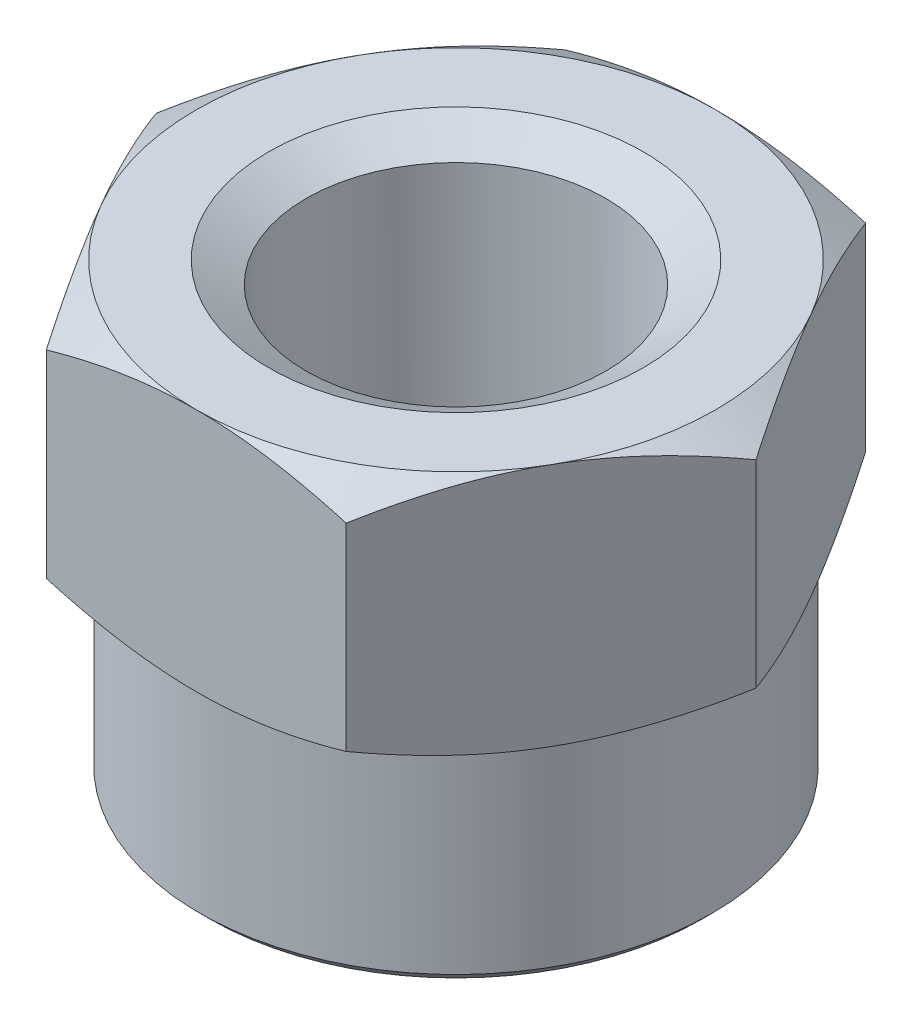
ISO-10303-21;
HEADER;
FILE_DESCRIPTION(('STEP AP214'),'2;1');
FILE_NAME('part.step','',(''),(''),'','','');
FILE_SCHEMA(('AUTOMOTIVE_DESIGN { 1 0 10303 214 1 1 1 1 }'));
ENDSEC;
DATA;
#1=APPLICATION_CONTEXT('core data for automotive mechanical design processes');
#2=APPLICATION_PROTOCOL_DEFINITION('international standard','automotive_design',2000,#1);
#3=PRODUCT_CONTEXT('',#1,'mechanical');
#4=PRODUCT('Part','Part','',(#3));
#5=PRODUCT_RELATED_PRODUCT_CATEGORY('part','',(#4));
#6=PRODUCT_DEFINITION_FORMATION('','',#4);
#7=PRODUCT_DEFINITION_CONTEXT('part definition',#1,'design');
#8=PRODUCT_DEFINITION('design','',#6,#7);
#9=PRODUCT_DEFINITION_SHAPE('','',#8);
#10=(LENGTH_UNIT() NAMED_UNIT(*) SI_UNIT(.MILLI.,.METRE.));
#11=(NAMED_UNIT(*) PLANE_ANGLE_UNIT() SI_UNIT($,.RADIAN.));
#12=(NAMED_UNIT(*) SI_UNIT($,.STERADIAN.) SOLID_ANGLE_UNIT());
#13=UNCERTAINTY_MEASURE_WITH_UNIT(LENGTH_MEASURE(1.E-05),#10,'distance_accuracy_value','');
#14=(GEOMETRIC_REPRESENTATION_CONTEXT(3) GLOBAL_UNCERTAINTY_ASSIGNED_CONTEXT((#13)) GLOBAL_UNIT_ASSIGNED_CONTEXT((#10,
#11,#12)) REPRESENTATION_CONTEXT('',''));
#15=CARTESIAN_POINT('',(0.,0.,0.));
#16=DIRECTION('',(0.,0.,1.));
#17=DIRECTION('',(1.,0.,0.));
#18=AXIS2_PLACEMENT_3D('',#15,#16,#17);
#19=CARTESIAN_POINT('',(-127.492839525484,85.4251261180788,144.216684572446));
#20=DIRECTION('',(0.,-1.,0.));
#21=DIRECTION('',(1.,0.,0.));
#22=AXIS2_PLACEMENT_3D('',#19,#20,#21);
#23=PLANE('',#22);
#24=CARTESIAN_POINT('',(-134.421042755759,85.4251261180788,156.216684572446));
#25=DIRECTION('',(0.,-1.,0.));
#26=DIRECTION('',(1.,0.,0.));
#27=AXIS2_PLACEMENT_3D('',#24,#25,#26);
#28=CIRCLE('',#27,6.9175);
#29=CARTESIAN_POINT('',(-127.503542755759,85.4251261180788,156.216684572446));
#30=VERTEX_POINT('',#29);
#31=EDGE_CURVE('E186',#30,#30,#28,.T.);
#32=ORIENTED_EDGE('',*,*,#31,.F.);
#33=EDGE_LOOP('',(#32));
#34=FACE_BOUND('',#33,.T.);
#35=CARTESIAN_POINT('',(-134.421042755759,85.4251261180788,156.216684572446));
#36=DIRECTION('',(0.,-1.,0.));
#37=DIRECTION('',(1.,0.,0.));
#38=AXIS2_PLACEMENT_3D('',#35,#36,#37);
#39=CIRCLE('',#38,11.3616);
#40=CARTESIAN_POINT('',(-145.782642755759,85.4251261180788,156.216684572446));
#41=VERTEX_POINT('',#40);
#42=EDGE_CURVE('E622',#41,#41,#39,.T.);
#43=ORIENTED_EDGE('',*,*,#42,.T.);
#44=EDGE_LOOP('',(#43));
#45=FACE_BOUND('',#44,.T.);
#46=ADVANCED_FACE('F17',(#34,#45),#23,.T.);
#47=CARTESIAN_POINT('',(-134.421042755759,95.9169228878033,156.216684572446));
#48=DIRECTION('',(0.,1.,0.));
#49=DIRECTION('',(-1.,0.,0.));
#50=AXIS2_PLACEMENT_3D('',#47,#48,#49);
#51=CONICAL_SURFACE('',#50,13.856406460551,1.0471975511966);
#52=CARTESIAN_POINT('',(-134.421042755759,94.8451261180788,156.216684572446));
#53=DIRECTION('',(0.,-1.,0.));
#54=DIRECTION('',(1.,0.,0.));
#55=AXIS2_PLACEMENT_3D('',#52,#53,#54);
#56=CIRCLE('',#55,12.);
#57=CARTESIAN_POINT('',(-124.028737910346,94.8451261180788,162.216684572446));
#58=VERTEX_POINT('',#57);
#59=CARTESIAN_POINT('',(-134.421042755759,94.8451261180788,168.216684572446));
#60=VERTEX_POINT('',#59);
#61=EDGE_CURVE('E290',#58,#60,#56,.T.);
#62=ORIENTED_EDGE('',*,*,#61,.F.);
#63=CARTESIAN_POINT('',(-127.492839525484,95.9169228878033,168.216684572446));
#64=CARTESIAN_POINT('',(-126.591725288899,95.39666434074,166.655908931258));
#65=CARTESIAN_POINT('',(-125.778549466148,95.1337403286441,165.247447090766));
#66=CARTESIAN_POINT('',(-124.885918563922,94.8451261180788,163.701365015704));
#67=CARTESIAN_POINT('',(-124.028737910346,94.8451261180788,162.216684572446));
#68=B_SPLINE_CURVE_WITH_KNOTS('',2,(#63,#64,#65,#66,#67),.UNSPECIFIED.,.F.,.F.,(3,2,3),(0.,0.5,
1.),.UNSPECIFIED.);
#69=CARTESIAN_POINT('',(-127.492839525484,95.9169228878033,168.216684572446));
#70=VERTEX_POINT('',#69);
#71=EDGE_CURVE('E305',#70,#58,#68,.T.);
#72=ORIENTED_EDGE('',*,*,#71,.F.);
#73=CARTESIAN_POINT('',(-134.421042755759,94.8451261180788,168.216684572446));
#74=CARTESIAN_POINT('',(-132.699530157322,94.8451261180788,168.216684572446));
#75=CARTESIAN_POINT('',(-130.905128043927,95.1363793830638,168.216684572446));
#76=CARTESIAN_POINT('',(-129.286779575425,95.3990570024314,168.216684572446));
#77=CARTESIAN_POINT('',(-127.492839525484,95.9169228878033,168.216684572446));
#78=B_SPLINE_CURVE_WITH_KNOTS('',2,(#73,#74,#75,#76,#77),.UNSPECIFIED.,.F.,.F.,(3,2,3),(0.,0.5,
1.),.UNSPECIFIED.);
#79=EDGE_CURVE('E339',#60,#70,#78,.T.);
#80=ORIENTED_EDGE('',*,*,#79,.F.);
#81=EDGE_LOOP('',(#62,#72,#80));
#82=FACE_BOUND('',#81,.T.);
#83=ADVANCED_FACE('F389',(#82),#51,.T.);
#84=CARTESIAN_POINT('',(-134.421042755759,95.9169228878033,156.216684572446));
#85=DIRECTION('',(0.,1.,0.));
#86=DIRECTION('',(-1.,0.,0.));
#87=AXIS2_PLACEMENT_3D('',#84,#85,#86);
#88=CONICAL_SURFACE('',#87,13.856406460551,1.0471975511966);
#89=CARTESIAN_POINT('',(-134.421042755759,94.8451261180788,156.216684572446));
#90=DIRECTION('',(0.,1.,0.));
#91=DIRECTION('',(-1.,0.,0.));
#92=AXIS2_PLACEMENT_3D('',#89,#90,#91);
#93=CIRCLE('',#92,12.);
#94=CARTESIAN_POINT('',(-144.813347601172,94.8451261180788,162.216684572446));
#95=VERTEX_POINT('',#94);
#96=EDGE_CURVE('E299',#95,#60,#93,.T.);
#97=ORIENTED_EDGE('',*,*,#96,.T.);
#98=CARTESIAN_POINT('',(-141.349245986035,95.9169228878033,168.216684572446));
#99=CARTESIAN_POINT('',(-139.542111405697,95.3952480695933,168.216684572446));
#100=CARTESIAN_POINT('',(-137.91165580831,95.1322856525952,168.216684572446));
#101=CARTESIAN_POINT('',(-136.131169928463,94.8451261180788,168.216684572446));
#102=CARTESIAN_POINT('',(-134.421042755759,94.8451261180788,168.216684572446));
#103=B_SPLINE_CURVE_WITH_KNOTS('',2,(#98,#99,#100,#101,#102),.UNSPECIFIED.,.F.,.F.,(3,2,3),(0.,
0.5,1.),.UNSPECIFIED.);
#104=CARTESIAN_POINT('',(-141.349245986035,95.9169228878033,168.216684572446));
#105=VERTEX_POINT('',#104);
#106=EDGE_CURVE('E1142',#105,#60,#103,.T.);
#107=ORIENTED_EDGE('',*,*,#106,.F.);
#108=CARTESIAN_POINT('',(-144.813347601172,94.8451261180788,162.216684572446));
#109=CARTESIAN_POINT('',(-143.95538175542,94.8451261180788,163.702725008448));
#110=CARTESIAN_POINT('',(-143.061328131433,95.1344545270222,165.251271309884));
#111=CARTESIAN_POINT('',(-142.24945029446,95.3971896880079,166.657484973061));
#112=CARTESIAN_POINT('',(-141.349245986035,95.9169228878033,168.216684572446));
#113=B_SPLINE_CURVE_WITH_KNOTS('',2,(#108,#109,#110,#111,#112),.UNSPECIFIED.,.F.,.F.,(3,2,3),
(0.,0.5,1.),.UNSPECIFIED.);
#114=EDGE_CURVE('E461',#95,#105,#113,.T.);
#115=ORIENTED_EDGE('',*,*,#114,.F.);
#116=EDGE_LOOP('',(#97,#107,#115));
#117=FACE_BOUND('',#116,.T.);
#118=ADVANCED_FACE('F399',(#117),#88,.T.);
#119=CARTESIAN_POINT('',(-134.421042755759,95.9169228878033,156.216684572446));
#120=DIRECTION('',(0.,1.,0.));
#121=DIRECTION('',(-1.,0.,0.));
#122=AXIS2_PLACEMENT_3D('',#119,#120,#121);
#123=CONICAL_SURFACE('',#122,13.856406460551,1.0471975511966);
#124=CARTESIAN_POINT('',(-134.421042755759,94.8451261180788,156.216684572446));
#125=DIRECTION('',(0.,-1.,0.));
#126=DIRECTION('',(1.,0.,0.));
#127=AXIS2_PLACEMENT_3D('',#124,#125,#126);
#128=CIRCLE('',#127,12.);
#129=CARTESIAN_POINT('',(-144.813347601172,94.8451261180788,150.216684572446));
#130=VERTEX_POINT('',#129);
#131=CARTESIAN_POINT('',(-134.421042755759,94.8451261180788,144.216684572446));
#132=VERTEX_POINT('',#131);
#133=EDGE_CURVE('E538',#130,#132,#128,.T.);
#134=ORIENTED_EDGE('',*,*,#133,.F.);
#135=CARTESIAN_POINT('',(-141.349245986034,95.9169228878033,144.216684572446));
#136=CARTESIAN_POINT('',(-142.250360222537,95.3966643407877,145.777460213491));
#137=CARTESIAN_POINT('',(-143.06353604537,95.1337403286441,147.185922054126));
#138=CARTESIAN_POINT('',(-143.956166947525,94.8451261180788,148.732004129064));
#139=CARTESIAN_POINT('',(-144.813347601172,94.8451261180788,150.216684572446));
#140=B_SPLINE_CURVE_WITH_KNOTS('',2,(#135,#136,#137,#138,#139),.UNSPECIFIED.,.F.,.F.,(3,2,3),
(0.,0.5,1.),.UNSPECIFIED.);
#141=CARTESIAN_POINT('',(-141.349245986035,95.9169228878033,144.216684572446));
#142=VERTEX_POINT('',#141);
#143=EDGE_CURVE('E533',#142,#130,#140,.T.);
#144=ORIENTED_EDGE('',*,*,#143,.F.);
#145=CARTESIAN_POINT('',(-134.421042755759,94.8451261180788,144.216684572446));
#146=CARTESIAN_POINT('',(-136.130657325634,94.8451261180788,144.216684572446));
#147=CARTESIAN_POINT('',(-137.91165580831,95.1322856525952,144.216684572446));
#148=CARTESIAN_POINT('',(-139.541517516564,95.395076628568,144.216684572446));
#149=CARTESIAN_POINT('',(-141.349245986035,95.9169228878033,144.216684572446));
#150=B_SPLINE_CURVE_WITH_KNOTS('',2,(#145,#146,#147,#148,#149),.UNSPECIFIED.,.F.,.F.,(3,2,3),
(0.,0.5,1.),.UNSPECIFIED.);
#151=EDGE_CURVE('E1102',#132,#142,#150,.T.);
#152=ORIENTED_EDGE('',*,*,#151,.F.);
#153=EDGE_LOOP('',(#134,#144,#152));
#154=FACE_BOUND('',#153,.T.);
#155=ADVANCED_FACE('F540',(#154),#123,.T.);
#156=CARTESIAN_POINT('',(-134.421042755759,95.9169228878033,156.216684572446));
#157=DIRECTION('',(0.,1.,0.));
#158=DIRECTION('',(-1.,0.,0.));
#159=AXIS2_PLACEMENT_3D('',#156,#157,#158);
#160=CONICAL_SURFACE('',#159,13.856406460551,1.0471975511966);
#161=CARTESIAN_POINT('',(-124.028737910346,94.8451261180788,150.216684572446));
#162=CARTESIAN_POINT('',(-124.886703755996,94.8451261180788,148.730644136621));
#163=CARTESIAN_POINT('',(-125.780757380085,95.1344545270222,147.182097835008));
#164=CARTESIAN_POINT('',(-126.592635216939,95.3971896879393,145.775884172037));
#165=CARTESIAN_POINT('',(-127.492839525484,95.9169228878033,144.216684572446));
#166=B_SPLINE_CURVE_WITH_KNOTS('',2,(#161,#162,#163,#164,#165),.UNSPECIFIED.,.F.,.F.,(3,2,3),
(0.,0.5,1.),.UNSPECIFIED.);
#167=CARTESIAN_POINT('',(-124.028737910346,94.8451261180788,150.216684572446));
#168=VERTEX_POINT('',#167);
#169=CARTESIAN_POINT('',(-127.492839525484,95.9169228878032,144.216684572446));
#170=VERTEX_POINT('',#169);
#171=EDGE_CURVE('E31',#168,#170,#166,.T.);
#172=ORIENTED_EDGE('',*,*,#171,.F.);
#173=CARTESIAN_POINT('',(-134.421042755759,94.8451261180788,156.216684572446));
#174=DIRECTION('',(0.,-1.,0.));
#175=DIRECTION('',(1.,0.,0.));
#176=AXIS2_PLACEMENT_3D('',#173,#174,#175);
#177=CIRCLE('',#176,12.);
#178=EDGE_CURVE('E1096',#132,#168,#177,.T.);
#179=ORIENTED_EDGE('',*,*,#178,.F.);
#180=CARTESIAN_POINT('',(-127.492839525484,95.9169228878033,144.216684572446));
#181=CARTESIAN_POINT('',(-129.286192922811,95.3992263544539,144.216684572446));
#182=CARTESIAN_POINT('',(-130.905128043927,95.1363793830638,144.216684572446));
#183=CARTESIAN_POINT('',(-132.699024079063,94.8451261180788,144.216684572446));
#184=CARTESIAN_POINT('',(-134.421042755759,94.8451261180788,144.216684572446));
#185=B_SPLINE_CURVE_WITH_KNOTS('',2,(#180,#181,#182,#183,#184),.UNSPECIFIED.,.F.,.F.,(3,2,3),
(0.,0.5,1.),.UNSPECIFIED.);
#186=EDGE_CURVE('E566',#170,#132,#185,.T.);
#187=ORIENTED_EDGE('',*,*,#186,.F.);
#188=EDGE_LOOP('',(#172,#179,#187));
#189=FACE_BOUND('',#188,.T.);
#190=ADVANCED_FACE('F277',(#189),#160,.T.);
#191=CARTESIAN_POINT('',(-134.421042755759,95.9169228878033,156.216684572446));
#192=DIRECTION('',(0.,1.,0.));
#193=DIRECTION('',(-1.,0.,0.));
#194=AXIS2_PLACEMENT_3D('',#191,#192,#193);
#195=CONICAL_SURFACE('',#194,13.856406460551,1.0471975511966);
#196=CARTESIAN_POINT('',(-134.421042755759,94.8451261180788,156.216684572446));
#197=DIRECTION('',(0.,-1.,0.));
#198=DIRECTION('',(1.,0.,0.));
#199=AXIS2_PLACEMENT_3D('',#196,#197,#198);
#200=CIRCLE('',#199,12.);
#201=EDGE_CURVE('E300',#168,#58,#200,.T.);
#202=ORIENTED_EDGE('',*,*,#201,.F.);
#203=CARTESIAN_POINT('',(-120.564636295208,95.9169228878033,156.216684572446));
#204=CARTESIAN_POINT('',(-121.465750531821,95.3966643407236,154.655908931208));
#205=CARTESIAN_POINT('',(-122.278926354544,95.1337403286441,153.247447090766));
#206=CARTESIAN_POINT('',(-123.171557256795,94.8451261180788,151.701365015662));
#207=CARTESIAN_POINT('',(-124.028737910346,94.8451261180788,150.216684572446));
#208=B_SPLINE_CURVE_WITH_KNOTS('',2,(#203,#204,#205,#206,#207),.UNSPECIFIED.,.F.,.F.,(3,2,3),
(0.,0.5,1.),.UNSPECIFIED.);
#209=CARTESIAN_POINT('',(-120.564636295208,95.9169228878033,156.216684572446));
#210=VERTEX_POINT('',#209);
#211=EDGE_CURVE('E45',#210,#168,#208,.T.);
#212=ORIENTED_EDGE('',*,*,#211,.F.);
#213=CARTESIAN_POINT('',(-124.028737910346,94.8451261180788,162.216684572446));
#214=CARTESIAN_POINT('',(-123.17077206469,94.8451261180788,160.730644136611));
#215=CARTESIAN_POINT('',(-122.276718440607,95.1344545270222,159.182097835008));
#216=CARTESIAN_POINT('',(-121.464840603746,95.3971896879432,157.775884172026));
#217=CARTESIAN_POINT('',(-120.564636295208,95.9169228878033,156.216684572446));
#218=B_SPLINE_CURVE_WITH_KNOTS('',2,(#213,#214,#215,#216,#217),.UNSPECIFIED.,.F.,.F.,(3,2,3),
(0.,0.5,1.),.UNSPECIFIED.);
#219=EDGE_CURVE('E333',#58,#210,#218,.T.);
#220=ORIENTED_EDGE('',*,*,#219,.F.);
#221=EDGE_LOOP('',(#202,#212,#220));
#222=FACE_BOUND('',#221,.T.);
#223=ADVANCED_FACE('F267',(#222),#195,.T.);
#224=CARTESIAN_POINT('',(-134.421042755759,106.125126118079,156.216684572446));
#225=DIRECTION('',(0.,-1.,0.));
#226=DIRECTION('',(1.,0.,0.));
#227=AXIS2_PLACEMENT_3D('',#224,#225,#226);
#228=CONICAL_SURFACE('',#227,12.,1.0471975511966);
#229=CARTESIAN_POINT('',(-124.028737910346,106.125126118079,162.216684572446));
#230=CARTESIAN_POINT('',(-124.88670375623,106.125126118079,163.702725008677));
#231=CARTESIAN_POINT('',(-125.780757380085,105.835797709135,165.251271309884));
#232=CARTESIAN_POINT('',(-126.592635217211,105.573062548061,166.657484973325));
#233=CARTESIAN_POINT('',(-127.492839525484,105.053329348354,168.216684572446));
#234=B_SPLINE_CURVE_WITH_KNOTS('',2,(#229,#230,#231,#232,#233),.UNSPECIFIED.,.F.,.F.,(3,2,3),
(0.,0.5,1.),.UNSPECIFIED.);
#235=CARTESIAN_POINT('',(-124.028737910346,106.125126118079,162.216684572446));
#236=VERTEX_POINT('',#235);
#237=CARTESIAN_POINT('',(-127.492839525484,105.053329348354,168.216684572446));
#238=VERTEX_POINT('',#237);
#239=EDGE_CURVE('E157',#236,#238,#234,.T.);
#240=ORIENTED_EDGE('',*,*,#239,.F.);
#241=CARTESIAN_POINT('',(-134.421042755759,106.125126118079,156.216684572446));
#242=DIRECTION('',(0.,-1.,0.));
#243=DIRECTION('',(1.,0.,0.));
#244=AXIS2_PLACEMENT_3D('',#241,#242,#243);
#245=CIRCLE('',#244,12.);
#246=CARTESIAN_POINT('',(-134.421042755759,106.125126118079,168.216684572446));
#247=VERTEX_POINT('',#246);
#248=EDGE_CURVE('E161',#236,#247,#245,.T.);
#249=ORIENTED_EDGE('',*,*,#248,.T.);
#250=CARTESIAN_POINT('',(-127.492839525484,105.053329348354,168.216684572446));
#251=CARTESIAN_POINT('',(-129.286192923141,105.571025881799,168.216684572446));
#252=CARTESIAN_POINT('',(-130.905128043927,105.833872853094,168.216684572446));
#253=CARTESIAN_POINT('',(-132.699024079348,106.125126118079,168.216684572446));
#254=CARTESIAN_POINT('',(-134.421042755759,106.125126118079,168.216684572446));
#255=B_SPLINE_CURVE_WITH_KNOTS('',2,(#250,#251,#252,#253,#254),.UNSPECIFIED.,.F.,.F.,(3,2,3),
(0.,0.5,1.),.UNSPECIFIED.);
#256=EDGE_CURVE('E163',#238,#247,#255,.T.);
#257=ORIENTED_EDGE('',*,*,#256,.F.);
#258=EDGE_LOOP('',(#240,#249,#257));
#259=FACE_BOUND('',#258,.T.);
#260=ADVANCED_FACE('F160',(#259),#228,.T.);
#261=CARTESIAN_POINT('',(-134.421042755759,106.125126118079,156.216684572446));
#262=DIRECTION('',(0.,-1.,0.));
#263=DIRECTION('',(1.,0.,0.));
#264=AXIS2_PLACEMENT_3D('',#261,#262,#263);
#265=CONICAL_SURFACE('',#264,12.,1.0471975511966);
#266=CARTESIAN_POINT('',(-134.421042755759,106.125126118079,168.216684572446));
#267=CARTESIAN_POINT('',(-136.130657325348,106.125126118079,168.216684572446));
#268=CARTESIAN_POINT('',(-137.91165580831,105.837966583562,168.216684572446));
#269=CARTESIAN_POINT('',(-139.541517516233,105.575175607685,168.216684572446));
#270=CARTESIAN_POINT('',(-141.349245986035,105.053329348354,168.216684572446));
#271=B_SPLINE_CURVE_WITH_KNOTS('',2,(#266,#267,#268,#269,#270),.UNSPECIFIED.,.F.,.F.,(3,2,3),
(0.,0.5,1.),.UNSPECIFIED.);
#272=CARTESIAN_POINT('',(-141.349245986035,105.053329348354,168.216684572446));
#273=VERTEX_POINT('',#272);
#274=EDGE_CURVE('E416',#247,#273,#271,.T.);
#275=ORIENTED_EDGE('',*,*,#274,.F.);
#276=CARTESIAN_POINT('',(-134.421042755759,106.125126118079,156.216684572446));
#277=DIRECTION('',(0.,1.,0.));
#278=DIRECTION('',(-1.,0.,0.));
#279=AXIS2_PLACEMENT_3D('',#276,#277,#278);
#280=CIRCLE('',#279,12.);
#281=CARTESIAN_POINT('',(-144.813347601172,106.125126118079,162.216684572446));
#282=VERTEX_POINT('',#281);
#283=EDGE_CURVE('E183',#282,#247,#280,.T.);
#284=ORIENTED_EDGE('',*,*,#283,.F.);
#285=CARTESIAN_POINT('',(-141.349245986035,105.053329348354,168.216684572446));
#286=CARTESIAN_POINT('',(-142.250360222605,105.573587895409,166.655908931282));
#287=CARTESIAN_POINT('',(-143.063536045371,105.836511907514,165.247447090766));
#288=CARTESIAN_POINT('',(-143.956166947584,106.125126118079,163.701365015726));
#289=CARTESIAN_POINT('',(-144.813347601172,106.125126118079,162.216684572446));
#290=B_SPLINE_CURVE_WITH_KNOTS('',2,(#285,#286,#287,#288,#289),.UNSPECIFIED.,.F.,.F.,(3,2,3),
(0.,0.5,1.),.UNSPECIFIED.);
#291=EDGE_CURVE('E1143',#273,#282,#290,.T.);
#292=ORIENTED_EDGE('',*,*,#291,.F.);
#293=EDGE_LOOP('',(#275,#284,#292));
#294=FACE_BOUND('',#293,.T.);
#295=ADVANCED_FACE('F353',(#294),#265,.T.);
#296=CARTESIAN_POINT('',(-134.421042755759,106.125126118079,156.216684572446));
#297=DIRECTION('',(0.,-1.,0.));
#298=DIRECTION('',(1.,0.,0.));
#299=AXIS2_PLACEMENT_3D('',#296,#297,#298);
#300=CONICAL_SURFACE('',#299,12.,1.0471975511966);
#301=CARTESIAN_POINT('',(-134.421042755759,106.125126118079,156.216684572446));
#302=DIRECTION('',(0.,-1.,0.));
#303=DIRECTION('',(1.,0.,0.));
#304=AXIS2_PLACEMENT_3D('',#301,#302,#303);
#305=CIRCLE('',#304,12.);
#306=CARTESIAN_POINT('',(-144.813347601172,106.125126118079,150.216684572446));
#307=VERTEX_POINT('',#306);
#308=EDGE_CURVE('E1115',#282,#307,#305,.T.);
#309=ORIENTED_EDGE('',*,*,#308,.T.);
#310=CARTESIAN_POINT('',(-148.27744921631,105.053329348354,156.216684572446));
#311=CARTESIAN_POINT('',(-147.376334979689,105.573587895439,154.655908931194));
#312=CARTESIAN_POINT('',(-146.563159156974,105.836511907514,153.247447090766));
#313=CARTESIAN_POINT('',(-145.670528254716,106.125126118079,151.70136501565));
#314=CARTESIAN_POINT('',(-144.813347601172,106.125126118079,150.216684572446));
#315=B_SPLINE_CURVE_WITH_KNOTS('',2,(#310,#311,#312,#313,#314),.UNSPECIFIED.,.F.,.F.,(3,2,3),
(0.,0.5,1.),.UNSPECIFIED.);
#316=CARTESIAN_POINT('',(-148.27744921631,105.053329348354,156.216684572446));
#317=VERTEX_POINT('',#316);
#318=EDGE_CURVE('E1134',#317,#307,#315,.T.);
#319=ORIENTED_EDGE('',*,*,#318,.F.);
#320=CARTESIAN_POINT('',(-144.813347601172,106.125126118079,162.216684572446));
#321=CARTESIAN_POINT('',(-145.671313447017,106.125126118079,160.730644136285));
#322=CARTESIAN_POINT('',(-146.565367070911,105.835797709135,159.182097835008));
#323=CARTESIAN_POINT('',(-147.377244907991,105.573062548088,157.775884171648));
#324=CARTESIAN_POINT('',(-148.27744921631,105.053329348354,156.216684572446));
#325=B_SPLINE_CURVE_WITH_KNOTS('',2,(#320,#321,#322,#323,#324),.UNSPECIFIED.,.F.,.F.,(3,2,3),
(0.,0.5,1.),.UNSPECIFIED.);
#326=EDGE_CURVE('E1137',#282,#317,#325,.T.);
#327=ORIENTED_EDGE('',*,*,#326,.F.);
#328=EDGE_LOOP('',(#309,#319,#327));
#329=FACE_BOUND('',#328,.T.);
#330=ADVANCED_FACE('F441',(#329),#300,.T.);
#331=CARTESIAN_POINT('',(-134.421042755759,106.125126118079,156.216684572446));
#332=DIRECTION('',(0.,-1.,0.));
#333=DIRECTION('',(1.,0.,0.));
#334=AXIS2_PLACEMENT_3D('',#331,#332,#333);
#335=CONICAL_SURFACE('',#334,12.,1.0471975511966);
#336=CARTESIAN_POINT('',(-134.421042755759,106.125126118079,156.216684572446));
#337=DIRECTION('',(0.,-1.,0.));
#338=DIRECTION('',(1.,0.,0.));
#339=AXIS2_PLACEMENT_3D('',#336,#337,#338);
#340=CIRCLE('',#339,12.);
#341=CARTESIAN_POINT('',(-134.421042755759,106.125126118079,144.216684572446));
#342=VERTEX_POINT('',#341);
#343=EDGE_CURVE('E1110',#307,#342,#340,.T.);
#344=ORIENTED_EDGE('',*,*,#343,.T.);
#345=CARTESIAN_POINT('',(-141.349245986035,105.053329348354,144.216684572446));
#346=CARTESIAN_POINT('',(-139.542111405916,105.575004166501,144.216684572446));
#347=CARTESIAN_POINT('',(-137.91165580831,105.837966583562,144.216684572446));
#348=CARTESIAN_POINT('',(-136.131169928652,106.125126118079,144.216684572446));
#349=CARTESIAN_POINT('',(-134.421042755759,106.125126118079,144.216684572446));
#350=B_SPLINE_CURVE_WITH_KNOTS('',2,(#345,#346,#347,#348,#349),.UNSPECIFIED.,.F.,.F.,(3,2,3),
(0.,0.5,1.),.UNSPECIFIED.);
#351=CARTESIAN_POINT('',(-141.349245986035,105.053329348354,144.216684572446));
#352=VERTEX_POINT('',#351);
#353=EDGE_CURVE('E1090',#352,#342,#350,.T.);
#354=ORIENTED_EDGE('',*,*,#353,.F.);
#355=CARTESIAN_POINT('',(-144.813347601172,106.125126118079,150.216684572446));
#356=CARTESIAN_POINT('',(-143.95538175536,106.125126118079,148.730644136341));
#357=CARTESIAN_POINT('',(-143.061328131433,105.835797709135,147.182097835008));
#358=CARTESIAN_POINT('',(-142.249450294392,105.57306254811,145.775884171713));
#359=CARTESIAN_POINT('',(-141.349245986034,105.053329348354,144.216684572446));
#360=B_SPLINE_CURVE_WITH_KNOTS('',2,(#355,#356,#357,#358,#359),.UNSPECIFIED.,.F.,.F.,(3,2,3),
(0.,0.5,1.),.UNSPECIFIED.);
#361=EDGE_CURVE('E493',#307,#352,#360,.T.);
#362=ORIENTED_EDGE('',*,*,#361,.F.);
#363=EDGE_LOOP('',(#344,#354,#362));
#364=FACE_BOUND('',#363,.T.);
#365=ADVANCED_FACE('F507',(#364),#335,.T.);
#366=CARTESIAN_POINT('',(-134.421042755759,106.125126118079,156.216684572446));
#367=DIRECTION('',(0.,-1.,0.));
#368=DIRECTION('',(1.,0.,0.));
#369=AXIS2_PLACEMENT_3D('',#366,#367,#368);
#370=CONICAL_SURFACE('',#369,12.,1.0471975511966);
#371=CARTESIAN_POINT('',(-134.421042755759,106.125126118079,156.216684572446));
#372=DIRECTION('',(0.,-1.,0.));
#373=DIRECTION('',(1.,0.,0.));
#374=AXIS2_PLACEMENT_3D('',#371,#372,#373);
#375=CIRCLE('',#374,12.);
#376=CARTESIAN_POINT('',(-124.028737910346,106.125126118079,150.216684572446));
#377=VERTEX_POINT('',#376);
#378=EDGE_CURVE('E185',#342,#377,#375,.T.);
#379=ORIENTED_EDGE('',*,*,#378,.T.);
#380=CARTESIAN_POINT('',(-127.492839525484,105.053329348354,144.216684572446));
#381=CARTESIAN_POINT('',(-126.591725288982,105.57358789537,145.777460213491));
#382=CARTESIAN_POINT('',(-125.778549466148,105.836511907514,147.185922054126));
#383=CARTESIAN_POINT('',(-124.885918563993,106.125126118079,148.732004129064));
#384=CARTESIAN_POINT('',(-124.028737910346,106.125126118079,150.216684572446));
#385=B_SPLINE_CURVE_WITH_KNOTS('',2,(#380,#381,#382,#383,#384),.UNSPECIFIED.,.F.,.F.,(3,2,3),
(0.,0.5,1.),.UNSPECIFIED.);
#386=CARTESIAN_POINT('',(-127.492839525484,105.053329348354,144.216684572446));
#387=VERTEX_POINT('',#386);
#388=EDGE_CURVE('E11',#387,#377,#385,.T.);
#389=ORIENTED_EDGE('',*,*,#388,.F.);
#390=CARTESIAN_POINT('',(-134.421042755759,106.125126118079,144.216684572446));
#391=CARTESIAN_POINT('',(-132.699530157321,106.125126118079,144.216684572446));
#392=CARTESIAN_POINT('',(-130.905128043927,105.833872853094,144.216684572446));
#393=CARTESIAN_POINT('',(-129.286779575425,105.571195233726,144.216684572446));
#394=CARTESIAN_POINT('',(-127.492839525484,105.053329348354,144.216684572446));
#395=B_SPLINE_CURVE_WITH_KNOTS('',2,(#390,#391,#392,#393,#394),.UNSPECIFIED.,.F.,.F.,(3,2,3),
(0.,0.5,1.),.UNSPECIFIED.);
#396=EDGE_CURVE('E1083',#342,#387,#395,.T.);
#397=ORIENTED_EDGE('',*,*,#396,.F.);
#398=EDGE_LOOP('',(#379,#389,#397));
#399=FACE_BOUND('',#398,.T.);
#400=ADVANCED_FACE('F236',(#399),#370,.T.);
#401=CARTESIAN_POINT('',(-127.492839525484,106.125126118079,144.216684572446));
#402=DIRECTION('',(0.866025403784439,0.,-0.5));
#403=DIRECTION('',(0.,1.,0.));
#404=AXIS2_PLACEMENT_3D('',#401,#402,#403);
#405=PLANE('',#404);
#406=DIRECTION('',(0.,-1.,0.));
#407=VECTOR('',#406,1.);
#408=CARTESIAN_POINT('',(-120.564636295208,106.125126118079,156.216684572446));
#409=LINE('',#408,#407);
#410=CARTESIAN_POINT('',(-120.564636295208,105.053329348354,156.216684572446));
#411=VERTEX_POINT('',#410);
#412=EDGE_CURVE('E171',#411,#210,#409,.T.);
#413=ORIENTED_EDGE('',*,*,#412,.T.);
#414=ORIENTED_EDGE('',*,*,#211,.T.);
#415=ORIENTED_EDGE('',*,*,#171,.T.);
#416=DIRECTION('',(0.,-1.,0.));
#417=VECTOR('',#416,1.);
#418=CARTESIAN_POINT('',(-127.492839525484,106.125126118079,144.216684572446));
#419=LINE('',#418,#417);
#420=EDGE_CURVE('E1088',#387,#170,#419,.T.);
#421=ORIENTED_EDGE('',*,*,#420,.F.);
#422=ORIENTED_EDGE('',*,*,#388,.T.);
#423=CARTESIAN_POINT('',(-124.028737910346,106.125126118079,150.216684572446));
#424=CARTESIAN_POINT('',(-123.170772064461,106.125126118079,151.702725008677));
#425=CARTESIAN_POINT('',(-122.276718440607,105.835797709135,153.251271309884));
#426=CARTESIAN_POINT('',(-121.464840603481,105.573062548061,154.657484973325));
#427=CARTESIAN_POINT('',(-120.564636295208,105.053329348354,156.216684572446));
#428=B_SPLINE_CURVE_WITH_KNOTS('',2,(#423,#424,#425,#426,#427),.UNSPECIFIED.,.F.,.F.,(3,2,3),
(0.,0.5,1.),.UNSPECIFIED.);
#429=EDGE_CURVE('E198',#377,#411,#428,.T.);
#430=ORIENTED_EDGE('',*,*,#429,.T.);
#431=EDGE_LOOP('',(#413,#414,#415,#421,#422,#430));
#432=FACE_BOUND('',#431,.T.);
#433=ADVANCED_FACE('F227',(#432),#405,.T.);
#434=CARTESIAN_POINT('',(-120.564636295208,106.125126118079,156.216684572446));
#435=DIRECTION('',(0.866025403784439,0.,0.5));
#436=DIRECTION('',(0.,1.,0.));
#437=AXIS2_PLACEMENT_3D('',#434,#435,#436);
#438=PLANE('',#437);
#439=DIRECTION('',(0.,-1.,0.));
#440=VECTOR('',#439,1.);
#441=CARTESIAN_POINT('',(-127.492839525484,106.125126118079,168.216684572446));
#442=LINE('',#441,#440);
#443=EDGE_CURVE('E336',#238,#70,#442,.T.);
#444=ORIENTED_EDGE('',*,*,#443,.T.);
#445=ORIENTED_EDGE('',*,*,#71,.T.);
#446=ORIENTED_EDGE('',*,*,#219,.T.);
#447=ORIENTED_EDGE('',*,*,#412,.F.);
#448=CARTESIAN_POINT('',(-120.564636295208,105.053329348354,156.216684572446));
#449=CARTESIAN_POINT('',(-121.46575053168,105.573587895353,157.77746021344));
#450=CARTESIAN_POINT('',(-122.278926354544,105.836511907514,159.185922054126));
#451=CARTESIAN_POINT('',(-123.171557256673,106.125126118079,160.73200412902));
#452=CARTESIAN_POINT('',(-124.028737910346,106.125126118079,162.216684572446));
#453=B_SPLINE_CURVE_WITH_KNOTS('',2,(#448,#449,#450,#451,#452),.UNSPECIFIED.,.F.,.F.,(3,2,3),
(0.,0.5,1.),.UNSPECIFIED.);
#454=EDGE_CURVE('E189',#411,#236,#453,.T.);
#455=ORIENTED_EDGE('',*,*,#454,.T.);
#456=ORIENTED_EDGE('',*,*,#239,.T.);
#457=EDGE_LOOP('',(#444,#445,#446,#447,#455,#456));
#458=FACE_BOUND('',#457,.T.);
#459=ADVANCED_FACE('F191',(#458),#438,.T.);
#460=CARTESIAN_POINT('',(-127.492839525484,106.125126118079,168.216684572446));
#461=DIRECTION('',(0.,0.,1.));
#462=DIRECTION('',(1.,0.,0.));
#463=AXIS2_PLACEMENT_3D('',#460,#461,#462);
#464=PLANE('',#463);
#465=DIRECTION('',(0.,-1.,0.));
#466=VECTOR('',#465,1.);
#467=CARTESIAN_POINT('',(-141.349245986035,106.125126118079,168.216684572446));
#468=LINE('',#467,#466);
#469=EDGE_CURVE('E1147',#273,#105,#468,.T.);
#470=ORIENTED_EDGE('',*,*,#469,.T.);
#471=ORIENTED_EDGE('',*,*,#106,.T.);
#472=ORIENTED_EDGE('',*,*,#79,.T.);
#473=ORIENTED_EDGE('',*,*,#443,.F.);
#474=ORIENTED_EDGE('',*,*,#256,.T.);
#475=ORIENTED_EDGE('',*,*,#274,.T.);
#476=EDGE_LOOP('',(#470,#471,#472,#473,#474,#475));
#477=FACE_BOUND('',#476,.T.);
#478=ADVANCED_FACE('F280',(#477),#464,.T.);
#479=CARTESIAN_POINT('',(-141.349245986035,106.125126118079,168.216684572446));
#480=DIRECTION('',(-0.866025403784439,0.,0.5));
#481=DIRECTION('',(0.,-1.,0.));
#482=AXIS2_PLACEMENT_3D('',#479,#480,#481);
#483=PLANE('',#482);
#484=DIRECTION('',(0.,-1.,0.));
#485=VECTOR('',#484,1.);
#486=CARTESIAN_POINT('',(-148.27744921631,106.125126118079,156.216684572446));
#487=LINE('',#486,#485);
#488=CARTESIAN_POINT('',(-148.27744921631,95.9169228878033,156.216684572446));
#489=VERTEX_POINT('',#488);
#490=EDGE_CURVE('E1135',#317,#489,#487,.T.);
#491=ORIENTED_EDGE('',*,*,#490,.T.);
#492=CARTESIAN_POINT('',(-148.27744921631,95.9169228878033,156.216684572446));
#493=CARTESIAN_POINT('',(-147.376334979808,95.3966643407877,157.777460213491));
#494=CARTESIAN_POINT('',(-146.563159156974,95.1337403286441,159.185922054126));
#495=CARTESIAN_POINT('',(-145.67052825482,94.8451261180788,160.732004129064));
#496=CARTESIAN_POINT('',(-144.813347601172,94.8451261180788,162.216684572446));
#497=B_SPLINE_CURVE_WITH_KNOTS('',2,(#492,#493,#494,#495,#496),.UNSPECIFIED.,.F.,.F.,(3,2,3),
(0.,0.5,1.),.UNSPECIFIED.);
#498=EDGE_CURVE('E211',#489,#95,#497,.T.);
#499=ORIENTED_EDGE('',*,*,#498,.T.);
#500=ORIENTED_EDGE('',*,*,#114,.T.);
#501=ORIENTED_EDGE('',*,*,#469,.F.);
#502=ORIENTED_EDGE('',*,*,#291,.T.);
#503=ORIENTED_EDGE('',*,*,#326,.T.);
#504=EDGE_LOOP('',(#491,#499,#500,#501,#502,#503));
#505=FACE_BOUND('',#504,.T.);
#506=ADVANCED_FACE('F354',(#505),#483,.T.);
#507=CARTESIAN_POINT('',(-148.27744921631,106.125126118079,156.216684572446));
#508=DIRECTION('',(-0.866025403784439,0.,-0.5));
#509=DIRECTION('',(-0.5,0.,0.866025403784439));
#510=AXIS2_PLACEMENT_3D('',#507,#508,#509);
#511=PLANE('',#510);
#512=DIRECTION('',(0.,-1.,0.));
#513=VECTOR('',#512,1.);
#514=CARTESIAN_POINT('',(-141.349245986035,106.125126118079,144.216684572446));
#515=LINE('',#514,#513);
#516=EDGE_CURVE('E1129',#352,#142,#515,.T.);
#517=ORIENTED_EDGE('',*,*,#516,.T.);
#518=ORIENTED_EDGE('',*,*,#143,.T.);
#519=CARTESIAN_POINT('',(-144.813347601172,94.8451261180788,150.216684572446));
#520=CARTESIAN_POINT('',(-145.671313446893,94.8451261180788,151.702725008393));
#521=CARTESIAN_POINT('',(-146.565367070911,95.1344545270222,153.251271309884));
#522=CARTESIAN_POINT('',(-147.377244907848,95.3971896879866,154.657484972997));
#523=CARTESIAN_POINT('',(-148.27744921631,95.9169228878033,156.216684572446));
#524=B_SPLINE_CURVE_WITH_KNOTS('',2,(#519,#520,#521,#522,#523),.UNSPECIFIED.,.F.,.F.,(3,2,3),
(0.,0.5,1.),.UNSPECIFIED.);
#525=EDGE_CURVE('E203',#130,#489,#524,.T.);
#526=ORIENTED_EDGE('',*,*,#525,.T.);
#527=ORIENTED_EDGE('',*,*,#490,.F.);
#528=ORIENTED_EDGE('',*,*,#318,.T.);
#529=ORIENTED_EDGE('',*,*,#361,.T.);
#530=EDGE_LOOP('',(#517,#518,#526,#527,#528,#529));
#531=FACE_BOUND('',#530,.T.);
#532=ADVANCED_FACE('F499',(#531),#511,.T.);
#533=CARTESIAN_POINT('',(-141.349245986035,106.125126118079,144.216684572446));
#534=DIRECTION('',(0.,0.,-1.));
#535=DIRECTION('',(0.,1.,0.));
#536=AXIS2_PLACEMENT_3D('',#533,#534,#535);
#537=PLANE('',#536);
#538=ORIENTED_EDGE('',*,*,#420,.T.);
#539=ORIENTED_EDGE('',*,*,#186,.T.);
#540=ORIENTED_EDGE('',*,*,#151,.T.);
#541=ORIENTED_EDGE('',*,*,#516,.F.);
#542=ORIENTED_EDGE('',*,*,#353,.T.);
#543=ORIENTED_EDGE('',*,*,#396,.T.);
#544=EDGE_LOOP('',(#538,#539,#540,#541,#542,#543));
#545=FACE_BOUND('',#544,.T.);
#546=ADVANCED_FACE('F442',(#545),#537,.T.);
#547=CARTESIAN_POINT('',(-127.492839525484,94.8451261180788,144.216684572446));
#548=DIRECTION('',(0.,-1.,0.));
#549=DIRECTION('',(1.,0.,0.));
#550=AXIS2_PLACEMENT_3D('',#547,#548,#549);
#551=PLANE('',#550);
#552=CARTESIAN_POINT('',(-134.421042755759,94.8451261180219,156.216684572446));
#553=DIRECTION('',(0.,-1.,0.));
#554=DIRECTION('',(1.,0.,0.));
#555=AXIS2_PLACEMENT_3D('',#552,#553,#554);
#556=CIRCLE('',#555,11.835);
#557=CARTESIAN_POINT('',(-146.256042755759,94.8451261180219,156.216684572446));
#558=VERTEX_POINT('',#557);
#559=EDGE_CURVE('E486',#558,#558,#556,.T.);
#560=ORIENTED_EDGE('',*,*,#559,.F.);
#561=EDGE_LOOP('',(#560));
#562=FACE_BOUND('',#561,.T.);
#563=ORIENTED_EDGE('',*,*,#201,.T.);
#564=ORIENTED_EDGE('',*,*,#61,.T.);
#565=ORIENTED_EDGE('',*,*,#96,.F.);
#566=CARTESIAN_POINT('',(-134.421042755759,94.8451261180788,156.216684572446));
#567=DIRECTION('',(0.,-1.,0.));
#568=DIRECTION('',(1.,0.,0.));
#569=AXIS2_PLACEMENT_3D('',#566,#567,#568);
#570=CIRCLE('',#569,12.);
#571=EDGE_CURVE('E477',#95,#130,#570,.T.);
#572=ORIENTED_EDGE('',*,*,#571,.T.);
#573=ORIENTED_EDGE('',*,*,#133,.T.);
#574=ORIENTED_EDGE('',*,*,#178,.T.);
#575=EDGE_LOOP('',(#563,#564,#565,#572,#573,#574));
#576=FACE_BOUND('',#575,.T.);
#577=ADVANCED_FACE('F723',(#562,#576),#551,.T.);
#578=CARTESIAN_POINT('',(-127.492839525484,106.125126118079,144.216684572446));
#579=DIRECTION('',(0.,-1.,0.));
#580=DIRECTION('',(1.,0.,0.));
#581=AXIS2_PLACEMENT_3D('',#578,#579,#580);
#582=PLANE('',#581);
#583=CARTESIAN_POINT('',(-134.421042755759,106.125126118079,156.216684572446));
#584=DIRECTION('',(0.,1.,0.));
#585=DIRECTION('',(-1.,0.,0.));
#586=AXIS2_PLACEMENT_3D('',#583,#584,#585);
#587=CIRCLE('',#586,8.65);
#588=CARTESIAN_POINT('',(-143.071042755759,106.125126118079,156.216684572446));
#589=VERTEX_POINT('',#588);
#590=EDGE_CURVE('E618',#589,#589,#587,.T.);
#591=ORIENTED_EDGE('',*,*,#590,.F.);
#592=EDGE_LOOP('',(#591));
#593=FACE_BOUND('',#592,.T.);
#594=ORIENTED_EDGE('',*,*,#248,.F.);
#595=CARTESIAN_POINT('',(-134.421042755759,106.125126118079,156.216684572446));
#596=DIRECTION('',(0.,-1.,0.));
#597=DIRECTION('',(1.,0.,0.));
#598=AXIS2_PLACEMENT_3D('',#595,#596,#597);
#599=CIRCLE('',#598,12.);
#600=EDGE_CURVE('E180',#377,#236,#599,.T.);
#601=ORIENTED_EDGE('',*,*,#600,.F.);
#602=ORIENTED_EDGE('',*,*,#378,.F.);
#603=ORIENTED_EDGE('',*,*,#343,.F.);
#604=ORIENTED_EDGE('',*,*,#308,.F.);
#605=ORIENTED_EDGE('',*,*,#283,.T.);
#606=EDGE_LOOP('',(#594,#601,#602,#603,#604,#605));
#607=FACE_BOUND('',#606,.T.);
#608=ADVANCED_FACE('F177',(#593,#607),#582,.F.);
#609=CARTESIAN_POINT('',(-134.421042755759,106.125126118079,156.216684572446));
#610=DIRECTION('',(0.,-1.,0.));
#611=DIRECTION('',(1.,0.,0.));
#612=AXIS2_PLACEMENT_3D('',#609,#610,#611);
#613=CYLINDRICAL_SURFACE('',#612,6.9175);
#614=ORIENTED_EDGE('',*,*,#31,.T.);
#615=EDGE_LOOP('',(#614));
#616=FACE_BOUND('',#615,.T.);
#617=CARTESIAN_POINT('',(-134.421042755759,105.124866776708,156.216684572446));
#618=DIRECTION('',(0.,1.,0.));
#619=DIRECTION('',(-1.,0.,0.));
#620=AXIS2_PLACEMENT_3D('',#617,#618,#619);
#621=CIRCLE('',#620,6.9175);
#622=CARTESIAN_POINT('',(-141.338542755759,105.124866776708,156.216684572446));
#623=VERTEX_POINT('',#622);
#624=EDGE_CURVE('E615',#623,#623,#621,.T.);
#625=ORIENTED_EDGE('',*,*,#624,.T.);
#626=EDGE_LOOP('',(#625));
#627=FACE_BOUND('',#626,.T.);
#628=ADVANCED_FACE('F548',(#616,#627),#613,.F.);
#629=CARTESIAN_POINT('',(-134.421042755759,106.125126118079,156.216684572446));
#630=DIRECTION('',(0.,-1.,0.));
#631=DIRECTION('',(1.,0.,0.));
#632=AXIS2_PLACEMENT_3D('',#629,#630,#631);
#633=CONICAL_SURFACE('',#632,12.,1.0471975511966);
#634=ORIENTED_EDGE('',*,*,#600,.T.);
#635=ORIENTED_EDGE('',*,*,#454,.F.);
#636=ORIENTED_EDGE('',*,*,#429,.F.);
#637=EDGE_LOOP('',(#634,#635,#636));
#638=FACE_BOUND('',#637,.T.);
#639=ADVANCED_FACE('F19',(#638),#633,.T.);
#640=CARTESIAN_POINT('',(-134.421042755759,95.9169228878033,156.216684572446));
#641=DIRECTION('',(0.,1.,0.));
#642=DIRECTION('',(-1.,0.,0.));
#643=AXIS2_PLACEMENT_3D('',#640,#641,#642);
#644=CONICAL_SURFACE('',#643,13.856406460551,1.0471975511966);
#645=ORIENTED_EDGE('',*,*,#571,.F.);
#646=ORIENTED_EDGE('',*,*,#498,.F.);
#647=ORIENTED_EDGE('',*,*,#525,.F.);
#648=EDGE_LOOP('',(#645,#646,#647));
#649=FACE_BOUND('',#648,.T.);
#650=ADVANCED_FACE('F237',(#649),#644,.T.);
#651=CARTESIAN_POINT('',(-134.421042755759,31.2506910967076,156.216684572446));
#652=DIRECTION('',(0.,1.,0.));
#653=DIRECTION('',(-1.,0.,0.));
#654=AXIS2_PLACEMENT_3D('',#651,#652,#653);
#655=CYLINDRICAL_SURFACE('',#654,11.835);
#656=ORIENTED_EDGE('',*,*,#559,.T.);
#657=EDGE_LOOP('',(#656));
#658=FACE_BOUND('',#657,.T.);
#659=CARTESIAN_POINT('',(-134.421042755759,85.8985261180788,156.216684572446));
#660=DIRECTION('',(0.,1.,0.));
#661=DIRECTION('',(1.,0.,0.));
#662=AXIS2_PLACEMENT_3D('',#659,#660,#661);
#663=CIRCLE('',#662,11.835);
#664=CARTESIAN_POINT('',(-146.256042755759,85.8985261180788,156.216684572446));
#665=VERTEX_POINT('',#664);
#666=EDGE_CURVE('E619',#665,#665,#663,.T.);
#667=ORIENTED_EDGE('',*,*,#666,.T.);
#668=EDGE_LOOP('',(#667));
#669=FACE_BOUND('',#668,.T.);
#670=ADVANCED_FACE('F240',(#658,#669),#655,.T.);
#671=CARTESIAN_POINT('',(-134.421042755759,105.124866776708,156.216684572446));
#672=DIRECTION('',(0.,1.,0.));
#673=DIRECTION('',(-1.,0.,0.));
#674=AXIS2_PLACEMENT_3D('',#671,#672,#673);
#675=CONICAL_SURFACE('',#674,6.9175,1.0471975511966);
#676=ORIENTED_EDGE('',*,*,#590,.T.);
#677=EDGE_LOOP('',(#676));
#678=FACE_BOUND('',#677,.T.);
#679=ORIENTED_EDGE('',*,*,#624,.F.);
#680=EDGE_LOOP('',(#679));
#681=FACE_BOUND('',#680,.T.);
#682=ADVANCED_FACE('F318',(#678,#681),#675,.F.);
#683=CARTESIAN_POINT('',(-134.421042755759,85.4251261180788,156.216684572446));
#684=DIRECTION('',(0.,1.,0.));
#685=DIRECTION('',(-1.,0.,0.));
#686=AXIS2_PLACEMENT_3D('',#683,#684,#685);
#687=CONICAL_SURFACE('',#686,11.3616,0.785398163397446);
#688=ORIENTED_EDGE('',*,*,#666,.F.);
#689=EDGE_LOOP('',(#688));
#690=FACE_BOUND('',#689,.T.);
#691=ORIENTED_EDGE('',*,*,#42,.F.);
#692=EDGE_LOOP('',(#691));
#693=FACE_BOUND('',#692,.T.);
#694=ADVANCED_FACE('F402',(#690,#693),#687,.T.);
#695=CLOSED_SHELL('',(#46,#83,#118,#155,#190,#223,#260,#295,#330,#365,#400,#433,#459,#478,#506,
#532,#546,#577,#608,#628,#639,#650,#670,#682,#694));
#696=MANIFOLD_SOLID_BREP('B1',#695);
#697=ADVANCED_BREP_SHAPE_REPRESENTATION('',(#18,#696),#14);
#698=SHAPE_DEFINITION_REPRESENTATION(#9,#697);
ENDSEC;
END-ISO-10303-21;
